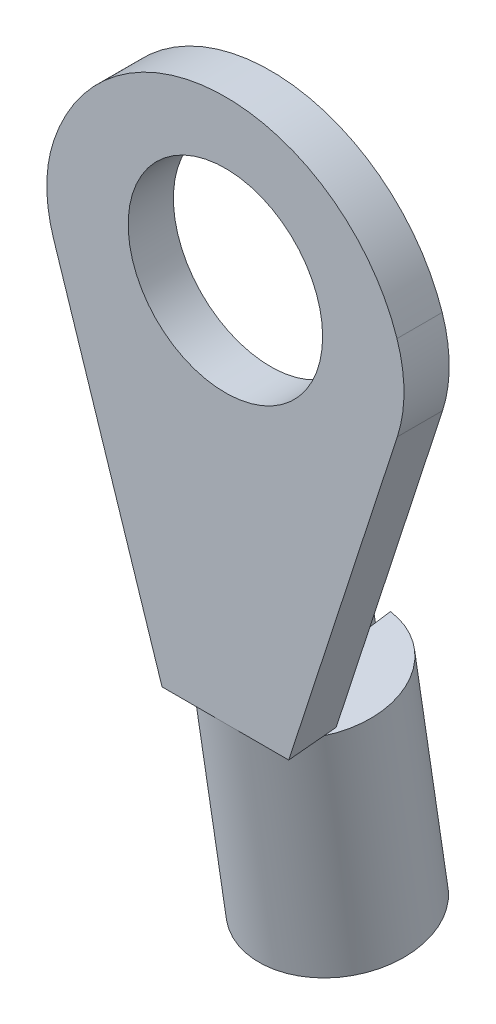
ISO-10303-21;
HEADER;
FILE_DESCRIPTION(('STEP AP214'),'2;1');
FILE_NAME('part.step','',(''),(''),'','','');
FILE_SCHEMA(('AUTOMOTIVE_DESIGN { 1 0 10303 214 1 1 1 1 }'));
ENDSEC;
DATA;
#1=APPLICATION_CONTEXT('core data for automotive mechanical design processes');
#2=APPLICATION_PROTOCOL_DEFINITION('international standard','automotive_design',2000,#1);
#3=PRODUCT_CONTEXT('',#1,'mechanical');
#4=PRODUCT('Part','Part','',(#3));
#5=PRODUCT_RELATED_PRODUCT_CATEGORY('part','',(#4));
#6=PRODUCT_DEFINITION_FORMATION('','',#4);
#7=PRODUCT_DEFINITION_CONTEXT('part definition',#1,'design');
#8=PRODUCT_DEFINITION('design','',#6,#7);
#9=PRODUCT_DEFINITION_SHAPE('','',#8);
#10=(LENGTH_UNIT() NAMED_UNIT(*) SI_UNIT(.MILLI.,.METRE.));
#11=(NAMED_UNIT(*) PLANE_ANGLE_UNIT() SI_UNIT($,.RADIAN.));
#12=(NAMED_UNIT(*) SI_UNIT($,.STERADIAN.) SOLID_ANGLE_UNIT());
#13=UNCERTAINTY_MEASURE_WITH_UNIT(LENGTH_MEASURE(1.E-05),#10,'distance_accuracy_value','');
#14=(GEOMETRIC_REPRESENTATION_CONTEXT(3) GLOBAL_UNCERTAINTY_ASSIGNED_CONTEXT((#13)) GLOBAL_UNIT_ASSIGNED_CONTEXT((#10,
#11,#12)) REPRESENTATION_CONTEXT('',''));
#15=CARTESIAN_POINT('',(0.,0.,0.));
#16=DIRECTION('',(0.,0.,1.));
#17=DIRECTION('',(1.,0.,0.));
#18=AXIS2_PLACEMENT_3D('',#15,#16,#17);
#19=CARTESIAN_POINT('',(0.,-12.6850859717136,-1.47234088217077));
#20=DIRECTION('',(0.,0.988936352868297,0.148340452930249));
#21=DIRECTION('',(0.,-0.148340452930249,0.988936352868297));
#22=AXIS2_PLACEMENT_3D('',#19,#20,#21);
#23=CYLINDRICAL_SURFACE('',#22,1.75);
#24=DIRECTION('',(0.,-0.988936352868297,-0.148340452930249));
#25=VECTOR('',#24,1.);
#26=CARTESIAN_POINT('',(-0.200000000000001,-7.48250930639282,-2.44993795738123));
#27=LINE('',#26,#25);
#28=CARTESIAN_POINT('',(-0.200000000000001,-7.48250930639282,-2.44993795738123));
#29=VERTEX_POINT('',#28);
#30=CARTESIAN_POINT('',(-0.200000000000001,-12.4271910707343,-3.19164022203247));
#31=VERTEX_POINT('',#30);
#32=EDGE_CURVE('E126',#29,#31,#27,.T.);
#33=ORIENTED_EDGE('',*,*,#32,.T.);
#34=CARTESIAN_POINT('',(0.,-12.6850859717136,-1.47234088217077));
#35=DIRECTION('',(0.,-0.988936352868297,-0.148340452930249));
#36=DIRECTION('',(0.,0.148340452930249,-0.988936352868297));
#37=AXIS2_PLACEMENT_3D('',#34,#35,#36);
#38=CIRCLE('',#37,1.75);
#39=CARTESIAN_POINT('',(0.2,-12.4271910707343,-3.19164022203247));
#40=VERTEX_POINT('',#39);
#41=EDGE_CURVE('E134',#40,#31,#38,.T.);
#42=ORIENTED_EDGE('',*,*,#41,.F.);
#43=DIRECTION('',(0.,-0.988936352868297,-0.148340452930249));
#44=VECTOR('',#43,1.);
#45=CARTESIAN_POINT('',(0.2,-7.48250930639282,-2.44993795738123));
#46=LINE('',#45,#44);
#47=CARTESIAN_POINT('',(0.2,-7.48250930639282,-2.44993795738124));
#48=VERTEX_POINT('',#47);
#49=EDGE_CURVE('E119',#48,#40,#46,.T.);
#50=ORIENTED_EDGE('',*,*,#49,.F.);
#51=CARTESIAN_POINT('',(0.,-7.74040420737207,-0.730638617519521));
#52=DIRECTION('',(0.,-0.988936352868297,-0.148340452930249));
#53=DIRECTION('',(0.,0.148340452930249,-0.988936352868297));
#54=AXIS2_PLACEMENT_3D('',#51,#52,#53);
#55=CIRCLE('',#54,1.75);
#56=CARTESIAN_POINT('',(1.43683992023372,-7.88859558064159,0.257303870943881));
#57=VERTEX_POINT('',#56);
#58=EDGE_CURVE('E150',#48,#57,#55,.T.);
#59=ORIENTED_EDGE('',*,*,#58,.T.);
#60=CARTESIAN_POINT('',(0.,-8.00000000000001,0.999999999999999));
#61=VERTEX_POINT('',#60);
#62=EDGE_CURVE('E142',#57,#61,#55,.T.);
#63=ORIENTED_EDGE('',*,*,#62,.T.);
#64=CARTESIAN_POINT('',(-1.43683992023371,-7.88859558064159,0.257303870943886));
#65=VERTEX_POINT('',#64);
#66=EDGE_CURVE('E151',#61,#65,#55,.T.);
#67=ORIENTED_EDGE('',*,*,#66,.T.);
#68=EDGE_CURVE('E148',#65,#29,#55,.T.);
#69=ORIENTED_EDGE('',*,*,#68,.T.);
#70=EDGE_LOOP('',(#33,#42,#50,#59,#63,#67,#69));
#71=FACE_BOUND('',#70,.T.);
#72=ADVANCED_FACE('F29',(#71),#23,.T.);
#73=CARTESIAN_POINT('',(0.,-12.6850859717136,-1.47234088217077));
#74=DIRECTION('',(0.,-0.988936352868297,-0.148340452930249));
#75=DIRECTION('',(0.,0.148340452930249,-0.988936352868297));
#76=AXIS2_PLACEMENT_3D('',#73,#74,#75);
#77=PLANE('',#76);
#78=ORIENTED_EDGE('',*,*,#41,.T.);
#79=DIRECTION('',(0.,-0.148340452930249,0.988936352868297));
#80=VECTOR('',#79,1.);
#81=CARTESIAN_POINT('',(-0.2,-12.5778593191862,-2.18718523235322));
#82=LINE('',#81,#80);
#83=CARTESIAN_POINT('',(-0.2,-12.5778593191862,-2.18718523235322));
#84=VERTEX_POINT('',#83);
#85=EDGE_CURVE('E137',#31,#84,#82,.T.);
#86=ORIENTED_EDGE('',*,*,#85,.T.);
#87=CARTESIAN_POINT('',(0.,-12.6850859717136,-1.47234088217077));
#88=DIRECTION('',(0.,-0.988936352868297,-0.148340452930249));
#89=DIRECTION('',(0.,0.148340452930249,-0.988936352868297));
#90=AXIS2_PLACEMENT_3D('',#87,#88,#89);
#91=CIRCLE('',#90,0.75);
#92=CARTESIAN_POINT('',(0.2,-12.5778593191862,-2.18718523235322));
#93=VERTEX_POINT('',#92);
#94=EDGE_CURVE('E136',#93,#84,#91,.T.);
#95=ORIENTED_EDGE('',*,*,#94,.F.);
#96=DIRECTION('',(0.,0.148340452930249,-0.988936352868297));
#97=VECTOR('',#96,1.);
#98=CARTESIAN_POINT('',(0.2,-12.5778593191862,-2.18718523235322));
#99=LINE('',#98,#97);
#100=EDGE_CURVE('E44',#93,#40,#99,.T.);
#101=ORIENTED_EDGE('',*,*,#100,.T.);
#102=EDGE_LOOP('',(#78,#86,#95,#101));
#103=FACE_BOUND('',#102,.T.);
#104=ADVANCED_FACE('F132',(#103),#77,.T.);
#105=CARTESIAN_POINT('',(0.,-7.74040420737207,-0.730638617519521));
#106=DIRECTION('',(0.,-0.988936352868297,-0.148340452930249));
#107=DIRECTION('',(0.,0.148340452930249,-0.988936352868297));
#108=AXIS2_PLACEMENT_3D('',#105,#106,#107);
#109=PLANE('',#108);
#110=DIRECTION('',(0.,-0.148340452930249,0.988936352868297));
#111=VECTOR('',#110,1.);
#112=CARTESIAN_POINT('',(-0.2,-7.63317755484471,-1.44548296770198));
#113=LINE('',#112,#111);
#114=CARTESIAN_POINT('',(-0.2,-7.6331775548447,-1.44548296770197));
#115=VERTEX_POINT('',#114);
#116=EDGE_CURVE('E52',#29,#115,#113,.T.);
#117=ORIENTED_EDGE('',*,*,#116,.F.);
#118=ORIENTED_EDGE('',*,*,#68,.F.);
#119=DIRECTION('',(0.0481428465872498,-0.148168446374334,0.987789642495553));
#120=VECTOR('',#119,1.);
#121=CARTESIAN_POINT('',(-1.46373305497934,-7.80582702257194,-0.294486516187048));
#122=LINE('',#121,#120);
#123=CARTESIAN_POINT('',(-1.44938038457171,-7.85,0.));
#124=VERTEX_POINT('',#123);
#125=EDGE_CURVE('E158',#124,#65,#122,.T.);
#126=ORIENTED_EDGE('',*,*,#125,.F.);
#127=DIRECTION('',(-1.,0.,0.));
#128=VECTOR('',#127,1.);
#129=CARTESIAN_POINT('',(0.,-7.85,0.));
#130=LINE('',#129,#128);
#131=CARTESIAN_POINT('',(-0.129058021166531,-7.85000000000001,0.));
#132=VERTEX_POINT('',#131);
#133=EDGE_CURVE('E200',#132,#124,#130,.T.);
#134=ORIENTED_EDGE('',*,*,#133,.F.);
#135=CARTESIAN_POINT('',(0.,-7.74040420737207,-0.730638617519521));
#136=DIRECTION('',(0.,-0.988936352868297,-0.148340452930249));
#137=DIRECTION('',(0.,0.148340452930249,-0.988936352868297));
#138=AXIS2_PLACEMENT_3D('',#135,#136,#137);
#139=CIRCLE('',#138,0.75);
#140=EDGE_CURVE('E11',#132,#115,#139,.T.);
#141=ORIENTED_EDGE('',*,*,#140,.T.);
#142=EDGE_LOOP('',(#117,#118,#126,#134,#141));
#143=FACE_BOUND('',#142,.T.);
#144=ADVANCED_FACE('F269',(#143),#109,.F.);
#145=DIRECTION('',(0.,0.148340452930249,-0.988936352868297));
#146=VECTOR('',#145,1.);
#147=CARTESIAN_POINT('',(0.2,-7.63317755484471,-1.44548296770198));
#148=LINE('',#147,#146);
#149=CARTESIAN_POINT('',(0.2,-7.63317755484471,-1.44548296770198));
#150=VERTEX_POINT('',#149);
#151=EDGE_CURVE('E122',#150,#48,#148,.T.);
#152=ORIENTED_EDGE('',*,*,#151,.F.);
#153=CARTESIAN_POINT('',(0.129058021166532,-7.85,0.));
#154=VERTEX_POINT('',#153);
#155=EDGE_CURVE('E37',#150,#154,#139,.T.);
#156=ORIENTED_EDGE('',*,*,#155,.T.);
#157=CARTESIAN_POINT('',(1.44938038457171,-7.85,0.));
#158=VERTEX_POINT('',#157);
#159=EDGE_CURVE('E201',#158,#154,#130,.T.);
#160=ORIENTED_EDGE('',*,*,#159,.F.);
#161=DIRECTION('',(0.0481428465872497,0.148168446374334,-0.987789642495553));
#162=VECTOR('',#161,1.);
#163=CARTESIAN_POINT('',(1.46373305497934,-7.80582702257194,-0.294486516187048));
#164=LINE('',#163,#162);
#165=EDGE_CURVE('E145',#57,#158,#164,.T.);
#166=ORIENTED_EDGE('',*,*,#165,.F.);
#167=ORIENTED_EDGE('',*,*,#58,.F.);
#168=EDGE_LOOP('',(#152,#156,#160,#166,#167));
#169=FACE_BOUND('',#168,.T.);
#170=ADVANCED_FACE('F229',(#169),#109,.F.);
#171=CARTESIAN_POINT('',(0.,-7.74040420737208,-0.730638617519521));
#172=DIRECTION('',(0.,-0.988936352868297,-0.148340452930249));
#173=DIRECTION('',(0.,0.148340452930249,-0.988936352868297));
#174=AXIS2_PLACEMENT_3D('',#171,#172,#173);
#175=CYLINDRICAL_SURFACE('',#174,0.75);
#176=DIRECTION('',(0.,-0.988936352868297,-0.148340452930249));
#177=VECTOR('',#176,1.);
#178=CARTESIAN_POINT('',(-0.2,-7.63317755484471,-1.44548296770198));
#179=LINE('',#178,#177);
#180=EDGE_CURVE('E217',#115,#84,#179,.T.);
#181=ORIENTED_EDGE('',*,*,#180,.F.);
#182=ORIENTED_EDGE('',*,*,#140,.F.);
#183=CARTESIAN_POINT('',(0.,-7.74040420737208,-0.730638617519521));
#184=DIRECTION('',(0.,-0.988936352868297,-0.148340452930249));
#185=DIRECTION('',(0.,0.148340452930249,-0.988936352868297));
#186=AXIS2_PLACEMENT_3D('',#183,#184,#185);
#187=CIRCLE('',#186,0.75);
#188=EDGE_CURVE('E210',#154,#132,#187,.T.);
#189=ORIENTED_EDGE('',*,*,#188,.F.);
#190=ORIENTED_EDGE('',*,*,#155,.F.);
#191=DIRECTION('',(0.,-0.988936352868297,-0.148340452930249));
#192=VECTOR('',#191,1.);
#193=CARTESIAN_POINT('',(0.2,-7.63317755484471,-1.44548296770198));
#194=LINE('',#193,#192);
#195=EDGE_CURVE('E127',#150,#93,#194,.T.);
#196=ORIENTED_EDGE('',*,*,#195,.T.);
#197=ORIENTED_EDGE('',*,*,#94,.T.);
#198=EDGE_LOOP('',(#181,#182,#189,#190,#196,#197));
#199=FACE_BOUND('',#198,.T.);
#200=ADVANCED_FACE('F226',(#199),#175,.F.);
#201=CARTESIAN_POINT('',(-3.94852050501276,-8.,1.));
#202=DIRECTION('',(0.,0.988936352868297,0.148340452930245));
#203=DIRECTION('',(0.,-0.148340452930245,0.988936352868298));
#204=AXIS2_PLACEMENT_3D('',#201,#202,#203);
#205=PLANE('',#204);
#206=ORIENTED_EDGE('',*,*,#62,.F.);
#207=CARTESIAN_POINT('',(1.40064243013678,-8.,1.));
#208=VERTEX_POINT('',#207);
#209=EDGE_CURVE('E154',#208,#57,#164,.T.);
#210=ORIENTED_EDGE('',*,*,#209,.F.);
#211=DIRECTION('',(1.,0.,0.));
#212=VECTOR('',#211,1.);
#213=CARTESIAN_POINT('',(1.40064243013678,-8.,1.));
#214=LINE('',#213,#212);
#215=EDGE_CURVE('E174',#61,#208,#214,.T.);
#216=ORIENTED_EDGE('',*,*,#215,.F.);
#217=EDGE_LOOP('',(#206,#210,#216));
#218=FACE_BOUND('',#217,.T.);
#219=ADVANCED_FACE('F252',(#218),#205,.F.);
#220=ORIENTED_EDGE('',*,*,#66,.F.);
#221=CARTESIAN_POINT('',(-1.40064243013677,-8.,1.));
#222=VERTEX_POINT('',#221);
#223=EDGE_CURVE('E175',#222,#61,#214,.T.);
#224=ORIENTED_EDGE('',*,*,#223,.F.);
#225=EDGE_CURVE('E157',#65,#222,#122,.T.);
#226=ORIENTED_EDGE('',*,*,#225,.F.);
#227=EDGE_LOOP('',(#220,#224,#226));
#228=FACE_BOUND('',#227,.T.);
#229=ADVANCED_FACE('F254',(#228),#205,.F.);
#230=CARTESIAN_POINT('',(0.,0.,1.));
#231=DIRECTION('',(0.,0.,-1.));
#232=DIRECTION('',(-1.,0.,0.));
#233=AXIS2_PLACEMENT_3D('',#230,#231,#232);
#234=CYLINDRICAL_SURFACE('',#233,4.);
#235=CARTESIAN_POINT('',(0.,0.,1.));
#236=DIRECTION('',(0.,0.,1.));
#237=DIRECTION('',(1.,0.,0.));
#238=AXIS2_PLACEMENT_3D('',#235,#236,#237);
#239=CIRCLE('',#238,4.);
#240=CARTESIAN_POINT('',(3.79408202005106,1.26686290699716,1.));
#241=VERTEX_POINT('',#240);
#242=CARTESIAN_POINT('',(-3.79408202005105,1.26686290699716,1.));
#243=VERTEX_POINT('',#242);
#244=EDGE_CURVE('E168',#241,#243,#239,.T.);
#245=ORIENTED_EDGE('',*,*,#244,.F.);
#246=DIRECTION('',(0.,0.,-1.));
#247=VECTOR('',#246,1.);
#248=CARTESIAN_POINT('',(3.79408202005106,1.26686290699716,1.));
#249=LINE('',#248,#247);
#250=CARTESIAN_POINT('',(3.79408202005106,1.26686290699716,0.));
#251=VERTEX_POINT('',#250);
#252=EDGE_CURVE('E183',#241,#251,#249,.T.);
#253=ORIENTED_EDGE('',*,*,#252,.T.);
#254=CARTESIAN_POINT('',(0.,0.,0.));
#255=DIRECTION('',(0.,0.,1.));
#256=DIRECTION('',(1.,0.,0.));
#257=AXIS2_PLACEMENT_3D('',#254,#255,#256);
#258=CIRCLE('',#257,4.);
#259=CARTESIAN_POINT('',(-3.79408202005105,1.26686290699716,0.));
#260=VERTEX_POINT('',#259);
#261=EDGE_CURVE('E160',#251,#260,#258,.T.);
#262=ORIENTED_EDGE('',*,*,#261,.T.);
#263=DIRECTION('',(0.,0.,-1.));
#264=VECTOR('',#263,1.);
#265=CARTESIAN_POINT('',(-3.79408202005106,1.26686290699717,1.));
#266=LINE('',#265,#264);
#267=EDGE_CURVE('E181',#260,#243,#266,.F.);
#268=ORIENTED_EDGE('',*,*,#267,.T.);
#269=EDGE_LOOP('',(#245,#253,#262,#268));
#270=FACE_BOUND('',#269,.T.);
#271=ADVANCED_FACE('F31',(#270),#234,.T.);
#272=CARTESIAN_POINT('',(-4.,0.,1.));
#273=DIRECTION('',(0.951056516295154,0.309016994374945,0.));
#274=DIRECTION('',(-0.309016994374945,0.951056516295155,0.));
#275=AXIS2_PLACEMENT_3D('',#272,#273,#274);
#276=PLANE('',#275);
#277=DIRECTION('',(0.309016994374945,-0.951056516295155,0.));
#278=VECTOR('',#277,1.);
#279=CARTESIAN_POINT('',(-4.,0.,0.));
#280=LINE('',#279,#278);
#281=CARTESIAN_POINT('',(-3.80169005389823,-0.610335256375543,0.));
#282=VERTEX_POINT('',#281);
#283=EDGE_CURVE('E163',#282,#124,#280,.T.);
#284=ORIENTED_EDGE('',*,*,#283,.T.);
#285=ORIENTED_EDGE('',*,*,#125,.T.);
#286=ORIENTED_EDGE('',*,*,#225,.T.);
#287=DIRECTION('',(0.309016994374945,-0.951056516295155,0.));
#288=VECTOR('',#287,1.);
#289=CARTESIAN_POINT('',(-4.,0.,1.));
#290=LINE('',#289,#288);
#291=CARTESIAN_POINT('',(-3.80169005389823,-0.610335256375543,1.));
#292=VERTEX_POINT('',#291);
#293=EDGE_CURVE('E171',#292,#222,#290,.T.);
#294=ORIENTED_EDGE('',*,*,#293,.F.);
#295=DIRECTION('',(0.,0.,-1.));
#296=VECTOR('',#295,1.);
#297=CARTESIAN_POINT('',(-3.80169005389823,-0.610335256375543,1.));
#298=LINE('',#297,#296);
#299=EDGE_CURVE('E197',#292,#282,#298,.T.);
#300=ORIENTED_EDGE('',*,*,#299,.T.);
#301=EDGE_LOOP('',(#284,#285,#286,#294,#300));
#302=FACE_BOUND('',#301,.T.);
#303=ADVANCED_FACE('F293',(#302),#276,.F.);
#304=CARTESIAN_POINT('',(4.,0.,1.));
#305=DIRECTION('',(-0.951056516295155,0.309016994374945,0.));
#306=DIRECTION('',(-0.309016994374945,-0.951056516295155,0.));
#307=AXIS2_PLACEMENT_3D('',#304,#305,#306);
#308=PLANE('',#307);
#309=DIRECTION('',(0.309016994374945,0.951056516295155,0.));
#310=VECTOR('',#309,1.);
#311=CARTESIAN_POINT('',(4.,0.,1.));
#312=LINE('',#311,#310);
#313=CARTESIAN_POINT('',(3.80169005389823,-0.610335256375545,1.));
#314=VERTEX_POINT('',#313);
#315=EDGE_CURVE('E178',#208,#314,#312,.T.);
#316=ORIENTED_EDGE('',*,*,#315,.F.);
#317=ORIENTED_EDGE('',*,*,#209,.T.);
#318=ORIENTED_EDGE('',*,*,#165,.T.);
#319=DIRECTION('',(0.309016994374945,0.951056516295155,0.));
#320=VECTOR('',#319,1.);
#321=CARTESIAN_POINT('',(4.,0.,0.));
#322=LINE('',#321,#320);
#323=CARTESIAN_POINT('',(3.80169005389823,-0.610335256375545,0.));
#324=VERTEX_POINT('',#323);
#325=EDGE_CURVE('E166',#158,#324,#322,.T.);
#326=ORIENTED_EDGE('',*,*,#325,.T.);
#327=DIRECTION('',(0.,0.,-1.));
#328=VECTOR('',#327,1.);
#329=CARTESIAN_POINT('',(3.80169005389823,-0.610335256375545,1.));
#330=LINE('',#329,#328);
#331=EDGE_CURVE('E191',#324,#314,#330,.F.);
#332=ORIENTED_EDGE('',*,*,#331,.T.);
#333=EDGE_LOOP('',(#316,#317,#318,#326,#332));
#334=FACE_BOUND('',#333,.T.);
#335=ADVANCED_FACE('F235',(#334),#308,.F.);
#336=CARTESIAN_POINT('',(0.,0.,1.));
#337=DIRECTION('',(0.,0.,1.));
#338=DIRECTION('',(1.,0.,0.));
#339=AXIS2_PLACEMENT_3D('',#336,#337,#338);
#340=PLANE('',#339);
#341=CARTESIAN_POINT('',(0.,0.481307348334109,1.));
#342=DIRECTION('',(0.,0.,1.));
#343=DIRECTION('',(1.,0.,0.));
#344=AXIS2_PLACEMENT_3D('',#341,#342,#343);
#345=CIRCLE('',#344,2.15);
#346=CARTESIAN_POINT('',(2.15,0.481307348334109,1.));
#347=VERTEX_POINT('',#346);
#348=EDGE_CURVE('E141',#347,#347,#345,.T.);
#349=ORIENTED_EDGE('',*,*,#348,.F.);
#350=EDGE_LOOP('',(#349));
#351=FACE_BOUND('',#350,.T.);
#352=ORIENTED_EDGE('',*,*,#315,.T.);
#353=CARTESIAN_POINT('',(0.948520505012764,0.316715726749289,1.));
#354=DIRECTION('',(0.,0.,1.));
#355=DIRECTION('',(1.,0.,0.));
#356=AXIS2_PLACEMENT_3D('',#353,#354,#355);
#357=CIRCLE('',#356,3.);
#358=EDGE_CURVE('E195',#314,#241,#357,.T.);
#359=ORIENTED_EDGE('',*,*,#358,.T.);
#360=ORIENTED_EDGE('',*,*,#244,.T.);
#361=CARTESIAN_POINT('',(-0.948520505012764,0.316715726749291,1.));
#362=DIRECTION('',(0.,0.,1.));
#363=DIRECTION('',(1.,0.,0.));
#364=AXIS2_PLACEMENT_3D('',#361,#362,#363);
#365=CIRCLE('',#364,3.);
#366=EDGE_CURVE('E193',#243,#292,#365,.T.);
#367=ORIENTED_EDGE('',*,*,#366,.T.);
#368=ORIENTED_EDGE('',*,*,#293,.T.);
#369=ORIENTED_EDGE('',*,*,#223,.T.);
#370=ORIENTED_EDGE('',*,*,#215,.T.);
#371=EDGE_LOOP('',(#352,#359,#360,#367,#368,#369,#370));
#372=FACE_BOUND('',#371,.T.);
#373=ADVANCED_FACE('F247',(#351,#372),#340,.T.);
#374=CARTESIAN_POINT('',(0.,0.,0.));
#375=DIRECTION('',(0.,0.,1.));
#376=DIRECTION('',(1.,0.,0.));
#377=AXIS2_PLACEMENT_3D('',#374,#375,#376);
#378=PLANE('',#377);
#379=CARTESIAN_POINT('',(0.,0.481307348334109,0.));
#380=DIRECTION('',(0.,0.,1.));
#381=DIRECTION('',(1.,0.,0.));
#382=AXIS2_PLACEMENT_3D('',#379,#380,#381);
#383=CIRCLE('',#382,2.15);
#384=CARTESIAN_POINT('',(2.15,0.481307348334109,0.));
#385=VERTEX_POINT('',#384);
#386=EDGE_CURVE('E203',#385,#385,#383,.T.);
#387=ORIENTED_EDGE('',*,*,#386,.T.);
#388=EDGE_LOOP('',(#387));
#389=FACE_BOUND('',#388,.T.);
#390=ORIENTED_EDGE('',*,*,#325,.F.);
#391=ORIENTED_EDGE('',*,*,#159,.T.);
#392=EDGE_CURVE('E204',#154,#132,#130,.T.);
#393=ORIENTED_EDGE('',*,*,#392,.T.);
#394=ORIENTED_EDGE('',*,*,#133,.T.);
#395=ORIENTED_EDGE('',*,*,#283,.F.);
#396=CARTESIAN_POINT('',(-0.948520505012764,0.316715726749291,0.));
#397=DIRECTION('',(0.,0.,1.));
#398=DIRECTION('',(1.,0.,0.));
#399=AXIS2_PLACEMENT_3D('',#396,#397,#398);
#400=CIRCLE('',#399,3.);
#401=EDGE_CURVE('E186',#282,#260,#400,.F.);
#402=ORIENTED_EDGE('',*,*,#401,.T.);
#403=ORIENTED_EDGE('',*,*,#261,.F.);
#404=CARTESIAN_POINT('',(0.948520505012764,0.316715726749289,0.));
#405=DIRECTION('',(0.,0.,1.));
#406=DIRECTION('',(1.,0.,0.));
#407=AXIS2_PLACEMENT_3D('',#404,#405,#406);
#408=CIRCLE('',#407,3.);
#409=EDGE_CURVE('E188',#251,#324,#408,.F.);
#410=ORIENTED_EDGE('',*,*,#409,.T.);
#411=EDGE_LOOP('',(#390,#391,#393,#394,#395,#402,#403,#410));
#412=FACE_BOUND('',#411,.T.);
#413=ADVANCED_FACE('F238',(#389,#412),#378,.F.);
#414=CARTESIAN_POINT('',(0.948520505012764,0.316715726749289,1.));
#415=DIRECTION('',(0.,0.,-1.));
#416=DIRECTION('',(-1.,0.,0.));
#417=AXIS2_PLACEMENT_3D('',#414,#415,#416);
#418=CYLINDRICAL_SURFACE('',#417,3.);
#419=ORIENTED_EDGE('',*,*,#358,.F.);
#420=ORIENTED_EDGE('',*,*,#331,.F.);
#421=ORIENTED_EDGE('',*,*,#409,.F.);
#422=ORIENTED_EDGE('',*,*,#252,.F.);
#423=EDGE_LOOP('',(#419,#420,#421,#422));
#424=FACE_BOUND('',#423,.T.);
#425=ADVANCED_FACE('F245',(#424),#418,.T.);
#426=CARTESIAN_POINT('',(-0.948520505012764,0.316715726749291,1.));
#427=DIRECTION('',(0.,0.,-1.));
#428=DIRECTION('',(-1.,0.,0.));
#429=AXIS2_PLACEMENT_3D('',#426,#427,#428);
#430=CYLINDRICAL_SURFACE('',#429,3.);
#431=ORIENTED_EDGE('',*,*,#366,.F.);
#432=ORIENTED_EDGE('',*,*,#267,.F.);
#433=ORIENTED_EDGE('',*,*,#401,.F.);
#434=ORIENTED_EDGE('',*,*,#299,.F.);
#435=EDGE_LOOP('',(#431,#432,#433,#434));
#436=FACE_BOUND('',#435,.T.);
#437=ADVANCED_FACE('F275',(#436),#430,.T.);
#438=CARTESIAN_POINT('',(0.,0.481307348334109,-3.));
#439=DIRECTION('',(0.,0.,1.));
#440=DIRECTION('',(1.,0.,0.));
#441=AXIS2_PLACEMENT_3D('',#438,#439,#440);
#442=CYLINDRICAL_SURFACE('',#441,2.15);
#443=ORIENTED_EDGE('',*,*,#348,.T.);
#444=EDGE_LOOP('',(#443));
#445=FACE_BOUND('',#444,.T.);
#446=ORIENTED_EDGE('',*,*,#386,.F.);
#447=EDGE_LOOP('',(#446));
#448=FACE_BOUND('',#447,.T.);
#449=ADVANCED_FACE('F272',(#445,#448),#442,.F.);
#450=CARTESIAN_POINT('',(0.,-7.74040420737208,-0.730638617519521));
#451=DIRECTION('',(0.,-0.988936352868297,-0.148340452930249));
#452=DIRECTION('',(0.,0.148340452930249,-0.988936352868297));
#453=AXIS2_PLACEMENT_3D('',#450,#451,#452);
#454=PLANE('',#453);
#455=ORIENTED_EDGE('',*,*,#392,.F.);
#456=ORIENTED_EDGE('',*,*,#188,.T.);
#457=EDGE_LOOP('',(#455,#456));
#458=FACE_BOUND('',#457,.T.);
#459=ADVANCED_FACE('F274',(#458),#454,.T.);
#460=CARTESIAN_POINT('',(0.2,-7.63317755484471,-1.44548296770198));
#461=DIRECTION('',(-1.,0.,0.));
#462=DIRECTION('',(0.,0.,1.));
#463=AXIS2_PLACEMENT_3D('',#460,#461,#462);
#464=PLANE('',#463);
#465=ORIENTED_EDGE('',*,*,#100,.F.);
#466=ORIENTED_EDGE('',*,*,#195,.F.);
#467=ORIENTED_EDGE('',*,*,#151,.T.);
#468=ORIENTED_EDGE('',*,*,#49,.T.);
#469=EDGE_LOOP('',(#465,#466,#467,#468));
#470=FACE_BOUND('',#469,.T.);
#471=ADVANCED_FACE('F120',(#470),#464,.T.);
#472=CARTESIAN_POINT('',(-0.2,-7.63317755484471,-1.44548296770198));
#473=DIRECTION('',(1.,0.,0.));
#474=DIRECTION('',(0.,0.,-1.));
#475=AXIS2_PLACEMENT_3D('',#472,#473,#474);
#476=PLANE('',#475);
#477=ORIENTED_EDGE('',*,*,#85,.F.);
#478=ORIENTED_EDGE('',*,*,#32,.F.);
#479=ORIENTED_EDGE('',*,*,#116,.T.);
#480=ORIENTED_EDGE('',*,*,#180,.T.);
#481=EDGE_LOOP('',(#477,#478,#479,#480));
#482=FACE_BOUND('',#481,.T.);
#483=ADVANCED_FACE('F315',(#482),#476,.T.);
#484=CLOSED_SHELL('',(#72,#104,#144,#170,#200,#219,#229,#271,#303,#335,#373,#413,#425,#437,#449,
#459,#471,#483));
#485=MANIFOLD_SOLID_BREP('B2',#484);
#486=ADVANCED_BREP_SHAPE_REPRESENTATION('',(#18,#485),#14);
#487=SHAPE_DEFINITION_REPRESENTATION(#9,#486);
ENDSEC;
END-ISO-10303-21;
